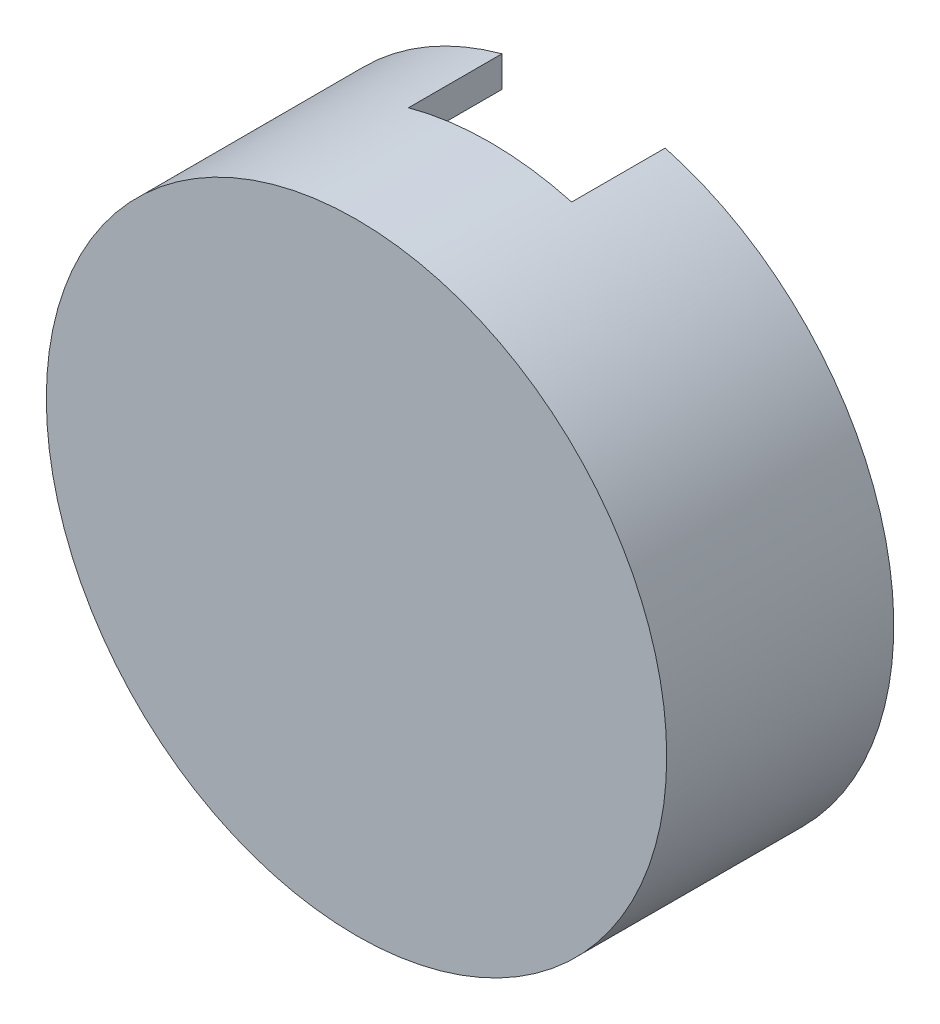
ISO-10303-21;
HEADER;
FILE_DESCRIPTION(('STEP AP214'),'2;1');
FILE_NAME('part.step','',(''),(''),'','','');
FILE_SCHEMA(('AUTOMOTIVE_DESIGN { 1 0 10303 214 1 1 1 1 }'));
ENDSEC;
DATA;
#1=APPLICATION_CONTEXT('core data for automotive mechanical design processes');
#2=APPLICATION_PROTOCOL_DEFINITION('international standard','automotive_design',2000,#1);
#3=PRODUCT_CONTEXT('',#1,'mechanical');
#4=PRODUCT('Part','Part','',(#3));
#5=PRODUCT_RELATED_PRODUCT_CATEGORY('part','',(#4));
#6=PRODUCT_DEFINITION_FORMATION('','',#4);
#7=PRODUCT_DEFINITION_CONTEXT('part definition',#1,'design');
#8=PRODUCT_DEFINITION('design','',#6,#7);
#9=PRODUCT_DEFINITION_SHAPE('','',#8);
#10=(LENGTH_UNIT() NAMED_UNIT(*) SI_UNIT(.MILLI.,.METRE.));
#11=(NAMED_UNIT(*) PLANE_ANGLE_UNIT() SI_UNIT($,.RADIAN.));
#12=(NAMED_UNIT(*) SI_UNIT($,.STERADIAN.) SOLID_ANGLE_UNIT());
#13=UNCERTAINTY_MEASURE_WITH_UNIT(LENGTH_MEASURE(1.E-05),#10,'distance_accuracy_value','');
#14=(GEOMETRIC_REPRESENTATION_CONTEXT(3) GLOBAL_UNCERTAINTY_ASSIGNED_CONTEXT((#13)) GLOBAL_UNIT_ASSIGNED_CONTEXT((#10,
#11,#12)) REPRESENTATION_CONTEXT('',''));
#15=CARTESIAN_POINT('',(0.,0.,0.));
#16=DIRECTION('',(0.,0.,1.));
#17=DIRECTION('',(1.,0.,0.));
#18=AXIS2_PLACEMENT_3D('',#15,#16,#17);
#19=CARTESIAN_POINT('',(0.00340061004067312,0.,8.034840547133));
#20=DIRECTION('',(0.,0.,-1.));
#21=DIRECTION('',(-1.,0.,0.));
#22=AXIS2_PLACEMENT_3D('',#19,#20,#21);
#23=CYLINDRICAL_SURFACE('',#22,20.902);
#24=CARTESIAN_POINT('',(0.00340061004067336,0.,10.034840547133));
#25=DIRECTION('',(0.,0.,-1.));
#26=DIRECTION('',(-1.,0.,0.));
#27=AXIS2_PLACEMENT_3D('',#24,#25,#26);
#28=CIRCLE('',#27,20.902);
#29=CARTESIAN_POINT('',(-20.8985993899593,0.,10.034840547133));
#30=VERTEX_POINT('',#29);
#31=EDGE_CURVE('E120',#30,#30,#28,.T.);
#32=ORIENTED_EDGE('',*,*,#31,.T.);
#33=EDGE_LOOP('',(#32));
#34=FACE_BOUND('',#33,.T.);
#35=DIRECTION('',(0.,0.,-1.));
#36=VECTOR('',#35,1.);
#37=CARTESIAN_POINT('',(-5.49659938995933,20.1654061203835,8.034840547133));
#38=LINE('',#37,#36);
#39=CARTESIAN_POINT('',(-5.49659938995933,20.1654061203835,-5.265159452867));
#40=VERTEX_POINT('',#39);
#41=CARTESIAN_POINT('',(-5.49659938995933,20.1654061203835,1.034840547133));
#42=VERTEX_POINT('',#41);
#43=EDGE_CURVE('E104',#40,#42,#38,.F.);
#44=ORIENTED_EDGE('',*,*,#43,.F.);
#45=CARTESIAN_POINT('',(0.00340061004067149,0.,-5.265159452867));
#46=DIRECTION('',(0.,0.,-1.));
#47=DIRECTION('',(-1.,0.,0.));
#48=AXIS2_PLACEMENT_3D('',#45,#46,#47);
#49=CIRCLE('',#48,20.902);
#50=CARTESIAN_POINT('',(5.50340061004067,20.1654061203835,-5.265159452867));
#51=VERTEX_POINT('',#50);
#52=EDGE_CURVE('E116',#51,#40,#49,.T.);
#53=ORIENTED_EDGE('',*,*,#52,.F.);
#54=DIRECTION('',(0.,0.,-1.));
#55=VECTOR('',#54,1.);
#56=CARTESIAN_POINT('',(5.50340061004067,20.1654061203835,8.034840547133));
#57=LINE('',#56,#55);
#58=CARTESIAN_POINT('',(5.50340061004067,20.1654061203835,1.034840547133));
#59=VERTEX_POINT('',#58);
#60=EDGE_CURVE('E159',#51,#59,#57,.F.);
#61=ORIENTED_EDGE('',*,*,#60,.T.);
#62=CARTESIAN_POINT('',(0.00340061004067226,0.,1.034840547133));
#63=DIRECTION('',(0.,0.,-1.));
#64=DIRECTION('',(-1.,0.,0.));
#65=AXIS2_PLACEMENT_3D('',#62,#63,#64);
#66=CIRCLE('',#65,20.902);
#67=EDGE_CURVE('E117',#42,#59,#66,.T.);
#68=ORIENTED_EDGE('',*,*,#67,.F.);
#69=EDGE_LOOP('',(#44,#53,#61,#68));
#70=FACE_BOUND('',#69,.T.);
#71=ADVANCED_FACE('F37',(#34,#70),#23,.T.);
#72=CARTESIAN_POINT('',(20.9054006100407,0.,-5.265159452867));
#73=DIRECTION('',(0.,0.,1.));
#74=DIRECTION('',(1.,0.,0.));
#75=AXIS2_PLACEMENT_3D('',#72,#73,#74);
#76=PLANE('',#75);
#77=DIRECTION('',(0.,-1.,0.));
#78=VECTOR('',#77,1.);
#79=CARTESIAN_POINT('',(-5.49659938995933,23.,-5.265159452867));
#80=LINE('',#79,#78);
#81=CARTESIAN_POINT('',(-5.49659938995933,18.0841257460791,-5.265159452867));
#82=VERTEX_POINT('',#81);
#83=EDGE_CURVE('E100',#40,#82,#80,.T.);
#84=ORIENTED_EDGE('',*,*,#83,.T.);
#85=CARTESIAN_POINT('',(0.00340061004067149,0.,-5.265159452867));
#86=DIRECTION('',(0.,0.,-1.));
#87=DIRECTION('',(-1.,0.,0.));
#88=AXIS2_PLACEMENT_3D('',#85,#86,#87);
#89=CIRCLE('',#88,18.902);
#90=CARTESIAN_POINT('',(5.50340061004067,18.0841257460791,-5.265159452867));
#91=VERTEX_POINT('',#90);
#92=EDGE_CURVE('E121',#91,#82,#89,.T.);
#93=ORIENTED_EDGE('',*,*,#92,.F.);
#94=DIRECTION('',(0.,-1.,0.));
#95=VECTOR('',#94,1.);
#96=CARTESIAN_POINT('',(5.50340061004067,23.,-5.265159452867));
#97=LINE('',#96,#95);
#98=EDGE_CURVE('E52',#51,#91,#97,.T.);
#99=ORIENTED_EDGE('',*,*,#98,.F.);
#100=ORIENTED_EDGE('',*,*,#52,.T.);
#101=EDGE_LOOP('',(#84,#93,#99,#100));
#102=FACE_BOUND('',#101,.T.);
#103=ADVANCED_FACE('F119',(#102),#76,.F.);
#104=CARTESIAN_POINT('',(0.00340061004067312,0.,8.034840547133));
#105=DIRECTION('',(0.,0.,-1.));
#106=DIRECTION('',(-1.,0.,0.));
#107=AXIS2_PLACEMENT_3D('',#104,#105,#106);
#108=CYLINDRICAL_SURFACE('',#107,18.902);
#109=CARTESIAN_POINT('',(0.00340061004067238,0.,2.03484054713301));
#110=DIRECTION('',(0.,0.,-1.));
#111=DIRECTION('',(-1.,0.,0.));
#112=AXIS2_PLACEMENT_3D('',#109,#110,#111);
#113=CIRCLE('',#112,18.902);
#114=CARTESIAN_POINT('',(-18.8985993899593,0.,2.03484054713301));
#115=VERTEX_POINT('',#114);
#116=EDGE_CURVE('E126',#115,#115,#113,.T.);
#117=ORIENTED_EDGE('',*,*,#116,.F.);
#118=EDGE_LOOP('',(#117));
#119=FACE_BOUND('',#118,.T.);
#120=DIRECTION('',(0.,0.,-1.));
#121=VECTOR('',#120,1.);
#122=CARTESIAN_POINT('',(-18.8572224973755,1.25,8.03484054713301));
#123=LINE('',#122,#121);
#124=CARTESIAN_POINT('',(-18.8572224973755,1.25,2.03));
#125=VERTEX_POINT('',#124);
#126=CARTESIAN_POINT('',(-18.8572224973755,1.25,0.));
#127=VERTEX_POINT('',#126);
#128=EDGE_CURVE('E138',#125,#127,#123,.T.);
#129=ORIENTED_EDGE('',*,*,#128,.T.);
#130=CARTESIAN_POINT('',(0.00340061004067214,0.,0.));
#131=DIRECTION('',(0.,0.,-1.));
#132=DIRECTION('',(-1.,0.,0.));
#133=AXIS2_PLACEMENT_3D('',#130,#131,#132);
#134=CIRCLE('',#133,18.902);
#135=CARTESIAN_POINT('',(-18.8572224973755,-1.25,0.));
#136=VERTEX_POINT('',#135);
#137=EDGE_CURVE('E147',#127,#136,#134,.F.);
#138=ORIENTED_EDGE('',*,*,#137,.T.);
#139=DIRECTION('',(0.,0.,-1.));
#140=VECTOR('',#139,1.);
#141=CARTESIAN_POINT('',(-18.8572224973755,-1.25,8.03484054713301));
#142=LINE('',#141,#140);
#143=CARTESIAN_POINT('',(-18.8572224973755,-1.25,2.03));
#144=VERTEX_POINT('',#143);
#145=EDGE_CURVE('E144',#136,#144,#142,.F.);
#146=ORIENTED_EDGE('',*,*,#145,.T.);
#147=CARTESIAN_POINT('',(0.00340061004067238,0.,2.03));
#148=DIRECTION('',(0.,0.,1.));
#149=DIRECTION('',(1.,0.,0.));
#150=AXIS2_PLACEMENT_3D('',#147,#148,#149);
#151=CIRCLE('',#150,18.902);
#152=EDGE_CURVE('E141',#144,#125,#151,.F.);
#153=ORIENTED_EDGE('',*,*,#152,.T.);
#154=EDGE_LOOP('',(#129,#138,#146,#153));
#155=FACE_BOUND('',#154,.T.);
#156=DIRECTION('',(0.,0.,-1.));
#157=VECTOR('',#156,1.);
#158=CARTESIAN_POINT('',(-5.49659938995933,18.0841257460791,8.034840547133));
#159=LINE('',#158,#157);
#160=CARTESIAN_POINT('',(-5.49659938995933,18.0841257460791,1.034840547133));
#161=VERTEX_POINT('',#160);
#162=EDGE_CURVE('E11',#161,#82,#159,.T.);
#163=ORIENTED_EDGE('',*,*,#162,.F.);
#164=CARTESIAN_POINT('',(0.00340061004067226,0.,1.034840547133));
#165=DIRECTION('',(0.,0.,-1.));
#166=DIRECTION('',(-1.,0.,0.));
#167=AXIS2_PLACEMENT_3D('',#164,#165,#166);
#168=CIRCLE('',#167,18.902);
#169=CARTESIAN_POINT('',(5.50340061004067,18.0841257460791,1.034840547133));
#170=VERTEX_POINT('',#169);
#171=EDGE_CURVE('E45',#170,#161,#168,.F.);
#172=ORIENTED_EDGE('',*,*,#171,.F.);
#173=DIRECTION('',(0.,0.,-1.));
#174=VECTOR('',#173,1.);
#175=CARTESIAN_POINT('',(5.50340061004067,18.0841257460791,8.034840547133));
#176=LINE('',#175,#174);
#177=EDGE_CURVE('E150',#170,#91,#176,.T.);
#178=ORIENTED_EDGE('',*,*,#177,.T.);
#179=ORIENTED_EDGE('',*,*,#92,.T.);
#180=EDGE_LOOP('',(#163,#172,#178,#179));
#181=FACE_BOUND('',#180,.T.);
#182=ADVANCED_FACE('F161',(#119,#155,#181),#108,.F.);
#183=CARTESIAN_POINT('',(-18.902,-1.25,0.));
#184=DIRECTION('',(0.,0.,-1.));
#185=DIRECTION('',(-1.,0.,0.));
#186=AXIS2_PLACEMENT_3D('',#183,#184,#185);
#187=PLANE('',#186);
#188=DIRECTION('',(1.,0.,0.));
#189=VECTOR('',#188,1.);
#190=CARTESIAN_POINT('',(-18.902,1.25,0.));
#191=LINE('',#190,#189);
#192=CARTESIAN_POINT('',(-16.402,1.25,0.));
#193=VERTEX_POINT('',#192);
#194=EDGE_CURVE('E174',#127,#193,#191,.T.);
#195=ORIENTED_EDGE('',*,*,#194,.T.);
#196=DIRECTION('',(0.,1.,0.));
#197=VECTOR('',#196,1.);
#198=CARTESIAN_POINT('',(-16.402,-1.25,0.));
#199=LINE('',#198,#197);
#200=CARTESIAN_POINT('',(-16.402,-1.25,0.));
#201=VERTEX_POINT('',#200);
#202=EDGE_CURVE('E60',#201,#193,#199,.T.);
#203=ORIENTED_EDGE('',*,*,#202,.F.);
#204=DIRECTION('',(1.,0.,0.));
#205=VECTOR('',#204,1.);
#206=CARTESIAN_POINT('',(-18.902,-1.25,0.));
#207=LINE('',#206,#205);
#208=EDGE_CURVE('E175',#136,#201,#207,.T.);
#209=ORIENTED_EDGE('',*,*,#208,.F.);
#210=ORIENTED_EDGE('',*,*,#137,.F.);
#211=EDGE_LOOP('',(#195,#203,#209,#210));
#212=FACE_BOUND('',#211,.T.);
#213=ADVANCED_FACE('F195',(#212),#187,.T.);
#214=CARTESIAN_POINT('',(-18.902,-1.25,2.03));
#215=DIRECTION('',(0.,-1.,0.));
#216=DIRECTION('',(0.,0.,-1.));
#217=AXIS2_PLACEMENT_3D('',#214,#215,#216);
#218=PLANE('',#217);
#219=ORIENTED_EDGE('',*,*,#208,.T.);
#220=DIRECTION('',(0.,0.,-1.));
#221=VECTOR('',#220,1.);
#222=CARTESIAN_POINT('',(-16.402,-1.25,2.03));
#223=LINE('',#222,#221);
#224=CARTESIAN_POINT('',(-16.402,-1.25,2.03));
#225=VERTEX_POINT('',#224);
#226=EDGE_CURVE('E172',#225,#201,#223,.T.);
#227=ORIENTED_EDGE('',*,*,#226,.F.);
#228=DIRECTION('',(1.,0.,0.));
#229=VECTOR('',#228,1.);
#230=CARTESIAN_POINT('',(-18.902,-1.25,2.03));
#231=LINE('',#230,#229);
#232=EDGE_CURVE('E179',#144,#225,#231,.T.);
#233=ORIENTED_EDGE('',*,*,#232,.F.);
#234=ORIENTED_EDGE('',*,*,#145,.F.);
#235=EDGE_LOOP('',(#219,#227,#233,#234));
#236=FACE_BOUND('',#235,.T.);
#237=ADVANCED_FACE('F208',(#236),#218,.T.);
#238=CARTESIAN_POINT('',(-18.902,1.25,2.03));
#239=DIRECTION('',(0.,0.,1.));
#240=DIRECTION('',(1.,0.,0.));
#241=AXIS2_PLACEMENT_3D('',#238,#239,#240);
#242=PLANE('',#241);
#243=ORIENTED_EDGE('',*,*,#232,.T.);
#244=DIRECTION('',(0.,-1.,0.));
#245=VECTOR('',#244,1.);
#246=CARTESIAN_POINT('',(-16.402,1.25,2.03));
#247=LINE('',#246,#245);
#248=CARTESIAN_POINT('',(-16.402,1.25,2.03));
#249=VERTEX_POINT('',#248);
#250=EDGE_CURVE('E170',#249,#225,#247,.T.);
#251=ORIENTED_EDGE('',*,*,#250,.F.);
#252=DIRECTION('',(1.,0.,0.));
#253=VECTOR('',#252,1.);
#254=CARTESIAN_POINT('',(-18.902,1.25,2.03));
#255=LINE('',#254,#253);
#256=EDGE_CURVE('E182',#125,#249,#255,.T.);
#257=ORIENTED_EDGE('',*,*,#256,.F.);
#258=ORIENTED_EDGE('',*,*,#152,.F.);
#259=EDGE_LOOP('',(#243,#251,#257,#258));
#260=FACE_BOUND('',#259,.T.);
#261=ADVANCED_FACE('F203',(#260),#242,.T.);
#262=CARTESIAN_POINT('',(-18.902,1.25,0.));
#263=DIRECTION('',(0.,1.,0.));
#264=DIRECTION('',(0.,0.,1.));
#265=AXIS2_PLACEMENT_3D('',#262,#263,#264);
#266=PLANE('',#265);
#267=ORIENTED_EDGE('',*,*,#256,.T.);
#268=DIRECTION('',(0.,0.,1.));
#269=VECTOR('',#268,1.);
#270=CARTESIAN_POINT('',(-16.402,1.25,0.));
#271=LINE('',#270,#269);
#272=EDGE_CURVE('E168',#193,#249,#271,.T.);
#273=ORIENTED_EDGE('',*,*,#272,.F.);
#274=ORIENTED_EDGE('',*,*,#194,.F.);
#275=ORIENTED_EDGE('',*,*,#128,.F.);
#276=EDGE_LOOP('',(#267,#273,#274,#275));
#277=FACE_BOUND('',#276,.T.);
#278=ADVANCED_FACE('F200',(#277),#266,.T.);
#279=CARTESIAN_POINT('',(0.00340061004067312,0.,8.034840547133));
#280=DIRECTION('',(0.,0.,-1.));
#281=DIRECTION('',(-1.,0.,0.));
#282=AXIS2_PLACEMENT_3D('',#279,#280,#281);
#283=CYLINDRICAL_SURFACE('',#282,17.402);
#284=CARTESIAN_POINT('',(0.00340061004067263,0.,4.03484054713301));
#285=DIRECTION('',(0.,0.,-1.));
#286=DIRECTION('',(-1.,0.,0.));
#287=AXIS2_PLACEMENT_3D('',#284,#285,#286);
#288=CIRCLE('',#287,17.402);
#289=CARTESIAN_POINT('',(-17.3985993899593,0.,4.03484054713301));
#290=VERTEX_POINT('',#289);
#291=EDGE_CURVE('E135',#290,#290,#288,.T.);
#292=ORIENTED_EDGE('',*,*,#291,.F.);
#293=EDGE_LOOP('',(#292));
#294=FACE_BOUND('',#293,.T.);
#295=CARTESIAN_POINT('',(0.00340061004067238,0.,2.03484054713301));
#296=DIRECTION('',(0.,0.,-1.));
#297=DIRECTION('',(-1.,0.,0.));
#298=AXIS2_PLACEMENT_3D('',#295,#296,#297);
#299=CIRCLE('',#298,17.402);
#300=CARTESIAN_POINT('',(-17.3985993899593,0.,2.03484054713301));
#301=VERTEX_POINT('',#300);
#302=EDGE_CURVE('E178',#301,#301,#299,.T.);
#303=ORIENTED_EDGE('',*,*,#302,.T.);
#304=EDGE_LOOP('',(#303));
#305=FACE_BOUND('',#304,.T.);
#306=ADVANCED_FACE('F39',(#294,#305),#283,.F.);
#307=CARTESIAN_POINT('',(17.4054006100407,0.,4.034840547133));
#308=DIRECTION('',(0.,0.,-1.));
#309=DIRECTION('',(-1.,0.,0.));
#310=AXIS2_PLACEMENT_3D('',#307,#308,#309);
#311=PLANE('',#310);
#312=CARTESIAN_POINT('',(0.00340061004067263,0.,4.03484054713301));
#313=DIRECTION('',(0.,0.,-1.));
#314=DIRECTION('',(-1.,0.,0.));
#315=AXIS2_PLACEMENT_3D('',#312,#313,#314);
#316=CIRCLE('',#315,18.902);
#317=CARTESIAN_POINT('',(-18.8985993899593,0.,4.03484054713301));
#318=VERTEX_POINT('',#317);
#319=EDGE_CURVE('E132',#318,#318,#316,.T.);
#320=ORIENTED_EDGE('',*,*,#319,.F.);
#321=EDGE_LOOP('',(#320));
#322=FACE_BOUND('',#321,.T.);
#323=ORIENTED_EDGE('',*,*,#291,.T.);
#324=EDGE_LOOP('',(#323));
#325=FACE_BOUND('',#324,.T.);
#326=ADVANCED_FACE('F237',(#322,#325),#311,.F.);
#327=CARTESIAN_POINT('',(0.00340061004067312,0.,8.034840547133));
#328=DIRECTION('',(0.,0.,-1.));
#329=DIRECTION('',(-1.,0.,0.));
#330=AXIS2_PLACEMENT_3D('',#327,#328,#329);
#331=CYLINDRICAL_SURFACE('',#330,18.902);
#332=CARTESIAN_POINT('',(0.00340061004067312,0.,8.034840547133));
#333=DIRECTION('',(0.,0.,-1.));
#334=DIRECTION('',(-1.,0.,0.));
#335=AXIS2_PLACEMENT_3D('',#332,#333,#334);
#336=CIRCLE('',#335,18.902);
#337=CARTESIAN_POINT('',(-18.8985993899593,0.,8.03484054713301));
#338=VERTEX_POINT('',#337);
#339=EDGE_CURVE('E124',#338,#338,#336,.T.);
#340=ORIENTED_EDGE('',*,*,#339,.F.);
#341=EDGE_LOOP('',(#340));
#342=FACE_BOUND('',#341,.T.);
#343=ORIENTED_EDGE('',*,*,#319,.T.);
#344=EDGE_LOOP('',(#343));
#345=FACE_BOUND('',#344,.T.);
#346=ADVANCED_FACE('F234',(#342,#345),#331,.F.);
#347=CARTESIAN_POINT('',(0.00340061004067312,0.,8.034840547133));
#348=DIRECTION('',(0.,0.,1.));
#349=DIRECTION('',(1.,0.,0.));
#350=AXIS2_PLACEMENT_3D('',#347,#348,#349);
#351=PLANE('',#350);
#352=ORIENTED_EDGE('',*,*,#339,.T.);
#353=EDGE_LOOP('',(#352));
#354=FACE_BOUND('',#353,.T.);
#355=ADVANCED_FACE('F230',(#354),#351,.F.);
#356=CARTESIAN_POINT('',(0.00340061004067336,0.,10.034840547133));
#357=DIRECTION('',(0.,0.,-1.));
#358=DIRECTION('',(-1.,0.,0.));
#359=AXIS2_PLACEMENT_3D('',#356,#357,#358);
#360=PLANE('',#359);
#361=ORIENTED_EDGE('',*,*,#31,.F.);
#362=EDGE_LOOP('',(#361));
#363=FACE_BOUND('',#362,.T.);
#364=ADVANCED_FACE('F227',(#363),#360,.F.);
#365=CARTESIAN_POINT('',(18.9054006100407,0.,2.034840547133));
#366=DIRECTION('',(0.,0.,1.));
#367=DIRECTION('',(1.,0.,0.));
#368=AXIS2_PLACEMENT_3D('',#365,#366,#367);
#369=PLANE('',#368);
#370=ORIENTED_EDGE('',*,*,#302,.F.);
#371=EDGE_LOOP('',(#370));
#372=FACE_BOUND('',#371,.T.);
#373=ORIENTED_EDGE('',*,*,#116,.T.);
#374=EDGE_LOOP('',(#373));
#375=FACE_BOUND('',#374,.T.);
#376=ADVANCED_FACE('F191',(#372,#375),#369,.F.);
#377=CARTESIAN_POINT('',(-16.402,0.,0.));
#378=DIRECTION('',(1.,0.,0.));
#379=DIRECTION('',(0.,0.,-1.));
#380=AXIS2_PLACEMENT_3D('',#377,#378,#379);
#381=PLANE('',#380);
#382=ORIENTED_EDGE('',*,*,#202,.T.);
#383=ORIENTED_EDGE('',*,*,#272,.T.);
#384=ORIENTED_EDGE('',*,*,#250,.T.);
#385=ORIENTED_EDGE('',*,*,#226,.T.);
#386=EDGE_LOOP('',(#382,#383,#384,#385));
#387=FACE_BOUND('',#386,.T.);
#388=ADVANCED_FACE('F206',(#387),#381,.T.);
#389=CARTESIAN_POINT('',(-5.49659938995933,23.,-5.265159452867));
#390=DIRECTION('',(1.,0.,0.));
#391=DIRECTION('',(0.,0.,-1.));
#392=AXIS2_PLACEMENT_3D('',#389,#390,#391);
#393=PLANE('',#392);
#394=ORIENTED_EDGE('',*,*,#43,.T.);
#395=DIRECTION('',(0.,-1.,0.));
#396=VECTOR('',#395,1.);
#397=CARTESIAN_POINT('',(-5.49659938995933,23.,1.034840547133));
#398=LINE('',#397,#396);
#399=EDGE_CURVE('E155',#42,#161,#398,.T.);
#400=ORIENTED_EDGE('',*,*,#399,.T.);
#401=ORIENTED_EDGE('',*,*,#162,.T.);
#402=ORIENTED_EDGE('',*,*,#83,.F.);
#403=EDGE_LOOP('',(#394,#400,#401,#402));
#404=FACE_BOUND('',#403,.T.);
#405=ADVANCED_FACE('F102',(#404),#393,.T.);
#406=CARTESIAN_POINT('',(-5.49659938995933,23.,1.034840547133));
#407=DIRECTION('',(0.,0.,-1.));
#408=DIRECTION('',(-1.,0.,0.));
#409=AXIS2_PLACEMENT_3D('',#406,#407,#408);
#410=PLANE('',#409);
#411=ORIENTED_EDGE('',*,*,#67,.T.);
#412=DIRECTION('',(0.,-1.,0.));
#413=VECTOR('',#412,1.);
#414=CARTESIAN_POINT('',(5.50340061004067,23.,1.034840547133));
#415=LINE('',#414,#413);
#416=EDGE_CURVE('E157',#59,#170,#415,.T.);
#417=ORIENTED_EDGE('',*,*,#416,.T.);
#418=ORIENTED_EDGE('',*,*,#171,.T.);
#419=ORIENTED_EDGE('',*,*,#399,.F.);
#420=EDGE_LOOP('',(#411,#417,#418,#419));
#421=FACE_BOUND('',#420,.T.);
#422=ADVANCED_FACE('F154',(#421),#410,.T.);
#423=CARTESIAN_POINT('',(5.50340061004067,23.,-5.265159452867));
#424=DIRECTION('',(1.,0.,0.));
#425=DIRECTION('',(0.,0.,-1.));
#426=AXIS2_PLACEMENT_3D('',#423,#424,#425);
#427=PLANE('',#426);
#428=ORIENTED_EDGE('',*,*,#98,.T.);
#429=ORIENTED_EDGE('',*,*,#177,.F.);
#430=ORIENTED_EDGE('',*,*,#416,.F.);
#431=ORIENTED_EDGE('',*,*,#60,.F.);
#432=EDGE_LOOP('',(#428,#429,#430,#431));
#433=FACE_BOUND('',#432,.T.);
#434=ADVANCED_FACE('F162',(#433),#427,.F.);
#435=CLOSED_SHELL('',(#71,#103,#182,#213,#237,#261,#278,#306,#326,#346,#355,#364,#376,#388,#405,
#422,#434));
#436=MANIFOLD_SOLID_BREP('B2',#435);
#437=ADVANCED_BREP_SHAPE_REPRESENTATION('',(#18,#436),#14);
#438=SHAPE_DEFINITION_REPRESENTATION(#9,#437);
ENDSEC;
END-ISO-10303-21;
